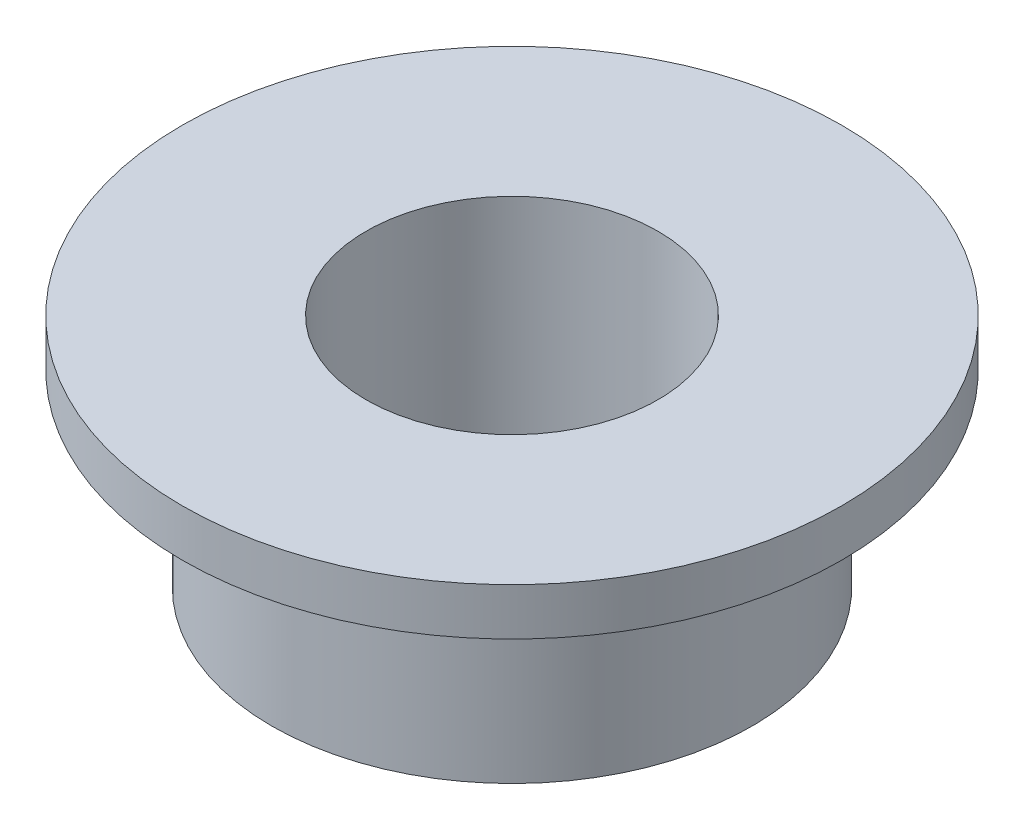
ISO-10303-21;
HEADER;
FILE_DESCRIPTION(('STEP AP214'),'2;1');
FILE_NAME('part.step','',(''),(''),'','','');
FILE_SCHEMA(('AUTOMOTIVE_DESIGN { 1 0 10303 214 1 1 1 1 }'));
ENDSEC;
DATA;
#1=APPLICATION_CONTEXT('core data for automotive mechanical design processes');
#2=APPLICATION_PROTOCOL_DEFINITION('international standard','automotive_design',2000,#1);
#3=PRODUCT_CONTEXT('',#1,'mechanical');
#4=PRODUCT('Part','Part','',(#3));
#5=PRODUCT_RELATED_PRODUCT_CATEGORY('part','',(#4));
#6=PRODUCT_DEFINITION_FORMATION('','',#4);
#7=PRODUCT_DEFINITION_CONTEXT('part definition',#1,'design');
#8=PRODUCT_DEFINITION('design','',#6,#7);
#9=PRODUCT_DEFINITION_SHAPE('','',#8);
#10=(LENGTH_UNIT() NAMED_UNIT(*) SI_UNIT(.MILLI.,.METRE.));
#11=(NAMED_UNIT(*) PLANE_ANGLE_UNIT() SI_UNIT($,.RADIAN.));
#12=(NAMED_UNIT(*) SI_UNIT($,.STERADIAN.) SOLID_ANGLE_UNIT());
#13=UNCERTAINTY_MEASURE_WITH_UNIT(LENGTH_MEASURE(1.E-05),#10,'distance_accuracy_value','');
#14=(GEOMETRIC_REPRESENTATION_CONTEXT(3) GLOBAL_UNCERTAINTY_ASSIGNED_CONTEXT((#13)) GLOBAL_UNIT_ASSIGNED_CONTEXT((#10,
#11,#12)) REPRESENTATION_CONTEXT('',''));
#15=CARTESIAN_POINT('',(0.,0.,0.));
#16=DIRECTION('',(0.,0.,1.));
#17=DIRECTION('',(1.,0.,0.));
#18=AXIS2_PLACEMENT_3D('',#15,#16,#17);
#19=CARTESIAN_POINT('',(0.,-5.,0.));
#20=DIRECTION('',(0.,1.,0.));
#21=DIRECTION('',(0.,0.,1.));
#22=AXIS2_PLACEMENT_3D('',#19,#20,#21);
#23=PLANE('',#22);
#24=CARTESIAN_POINT('',(0.,-5.,0.));
#25=DIRECTION('',(0.,1.,0.));
#26=DIRECTION('',(0.,0.,1.));
#27=AXIS2_PLACEMENT_3D('',#24,#25,#26);
#28=CIRCLE('',#27,12.75);
#29=CARTESIAN_POINT('',(0.,-5.,12.75));
#30=VERTEX_POINT('',#29);
#31=EDGE_CURVE('E35',#30,#30,#28,.T.);
#32=ORIENTED_EDGE('',*,*,#31,.F.);
#33=EDGE_LOOP('',(#32));
#34=FACE_BOUND('',#33,.T.);
#35=CARTESIAN_POINT('',(0.,-5.,0.));
#36=DIRECTION('',(0.,1.,0.));
#37=DIRECTION('',(0.,0.,1.));
#38=AXIS2_PLACEMENT_3D('',#35,#36,#37);
#39=CIRCLE('',#38,7.75);
#40=CARTESIAN_POINT('',(0.,-5.,7.75));
#41=VERTEX_POINT('',#40);
#42=EDGE_CURVE('E42',#41,#41,#39,.T.);
#43=ORIENTED_EDGE('',*,*,#42,.T.);
#44=EDGE_LOOP('',(#43));
#45=FACE_BOUND('',#44,.T.);
#46=ADVANCED_FACE('F31',(#34,#45),#23,.F.);
#47=CARTESIAN_POINT('',(0.,5.,0.));
#48=DIRECTION('',(0.,-1.,0.));
#49=DIRECTION('',(0.,0.,-1.));
#50=AXIS2_PLACEMENT_3D('',#47,#48,#49);
#51=CYLINDRICAL_SURFACE('',#50,12.75);
#52=CARTESIAN_POINT('',(0.,5.,0.));
#53=DIRECTION('',(0.,1.,0.));
#54=DIRECTION('',(0.,0.,1.));
#55=AXIS2_PLACEMENT_3D('',#52,#53,#54);
#56=CIRCLE('',#55,12.75);
#57=CARTESIAN_POINT('',(0.,5.,12.75));
#58=VERTEX_POINT('',#57);
#59=EDGE_CURVE('E10',#58,#58,#56,.T.);
#60=ORIENTED_EDGE('',*,*,#59,.F.);
#61=EDGE_LOOP('',(#60));
#62=FACE_BOUND('',#61,.T.);
#63=ORIENTED_EDGE('',*,*,#31,.T.);
#64=EDGE_LOOP('',(#63));
#65=FACE_BOUND('',#64,.T.);
#66=ADVANCED_FACE('F33',(#62,#65),#51,.T.);
#67=CARTESIAN_POINT('',(0.,5.,0.));
#68=DIRECTION('',(0.,-1.,0.));
#69=DIRECTION('',(0.,0.,-1.));
#70=AXIS2_PLACEMENT_3D('',#67,#68,#69);
#71=CYLINDRICAL_SURFACE('',#70,7.75);
#72=ORIENTED_EDGE('',*,*,#42,.F.);
#73=EDGE_LOOP('',(#72));
#74=FACE_BOUND('',#73,.T.);
#75=CARTESIAN_POINT('',(0.,7.5,0.));
#76=DIRECTION('',(0.,1.,0.));
#77=DIRECTION('',(0.,0.,1.));
#78=AXIS2_PLACEMENT_3D('',#75,#76,#77);
#79=CIRCLE('',#78,7.75);
#80=CARTESIAN_POINT('',(0.,7.5,7.75));
#81=VERTEX_POINT('',#80);
#82=EDGE_CURVE('E50',#81,#81,#79,.T.);
#83=ORIENTED_EDGE('',*,*,#82,.T.);
#84=EDGE_LOOP('',(#83));
#85=FACE_BOUND('',#84,.T.);
#86=ADVANCED_FACE('F56',(#74,#85),#71,.F.);
#87=CARTESIAN_POINT('',(0.,7.5,0.));
#88=DIRECTION('',(0.,1.,0.));
#89=DIRECTION('',(0.,0.,1.));
#90=AXIS2_PLACEMENT_3D('',#87,#88,#89);
#91=PLANE('',#90);
#92=CARTESIAN_POINT('',(0.,7.5,0.));
#93=DIRECTION('',(0.,1.,0.));
#94=DIRECTION('',(0.,0.,1.));
#95=AXIS2_PLACEMENT_3D('',#92,#93,#94);
#96=CIRCLE('',#95,17.5);
#97=CARTESIAN_POINT('',(0.,7.5,17.5));
#98=VERTEX_POINT('',#97);
#99=EDGE_CURVE('E46',#98,#98,#96,.T.);
#100=ORIENTED_EDGE('',*,*,#99,.T.);
#101=EDGE_LOOP('',(#100));
#102=FACE_BOUND('',#101,.T.);
#103=ORIENTED_EDGE('',*,*,#82,.F.);
#104=EDGE_LOOP('',(#103));
#105=FACE_BOUND('',#104,.T.);
#106=ADVANCED_FACE('F58',(#102,#105),#91,.T.);
#107=CARTESIAN_POINT('',(0.,5.,0.));
#108=DIRECTION('',(0.,1.,0.));
#109=DIRECTION('',(0.,0.,1.));
#110=AXIS2_PLACEMENT_3D('',#107,#108,#109);
#111=PLANE('',#110);
#112=ORIENTED_EDGE('',*,*,#59,.T.);
#113=EDGE_LOOP('',(#112));
#114=FACE_BOUND('',#113,.T.);
#115=CARTESIAN_POINT('',(0.,5.,0.));
#116=DIRECTION('',(0.,1.,0.));
#117=DIRECTION('',(0.,0.,1.));
#118=AXIS2_PLACEMENT_3D('',#115,#116,#117);
#119=CIRCLE('',#118,17.5);
#120=CARTESIAN_POINT('',(0.,5.,17.5));
#121=VERTEX_POINT('',#120);
#122=EDGE_CURVE('E47',#121,#121,#119,.T.);
#123=ORIENTED_EDGE('',*,*,#122,.F.);
#124=EDGE_LOOP('',(#123));
#125=FACE_BOUND('',#124,.T.);
#126=ADVANCED_FACE('F60',(#114,#125),#111,.F.);
#127=CARTESIAN_POINT('',(0.,7.5,0.));
#128=DIRECTION('',(0.,-1.,0.));
#129=DIRECTION('',(0.,0.,-1.));
#130=AXIS2_PLACEMENT_3D('',#127,#128,#129);
#131=CYLINDRICAL_SURFACE('',#130,17.5);
#132=ORIENTED_EDGE('',*,*,#99,.F.);
#133=EDGE_LOOP('',(#132));
#134=FACE_BOUND('',#133,.T.);
#135=ORIENTED_EDGE('',*,*,#122,.T.);
#136=EDGE_LOOP('',(#135));
#137=FACE_BOUND('',#136,.T.);
#138=ADVANCED_FACE('F67',(#134,#137),#131,.T.);
#139=CLOSED_SHELL('',(#46,#66,#86,#106,#126,#138));
#140=MANIFOLD_SOLID_BREP('B2',#139);
#141=ADVANCED_BREP_SHAPE_REPRESENTATION('',(#18,#140),#14);
#142=SHAPE_DEFINITION_REPRESENTATION(#9,#141);
ENDSEC;
END-ISO-10303-21;
